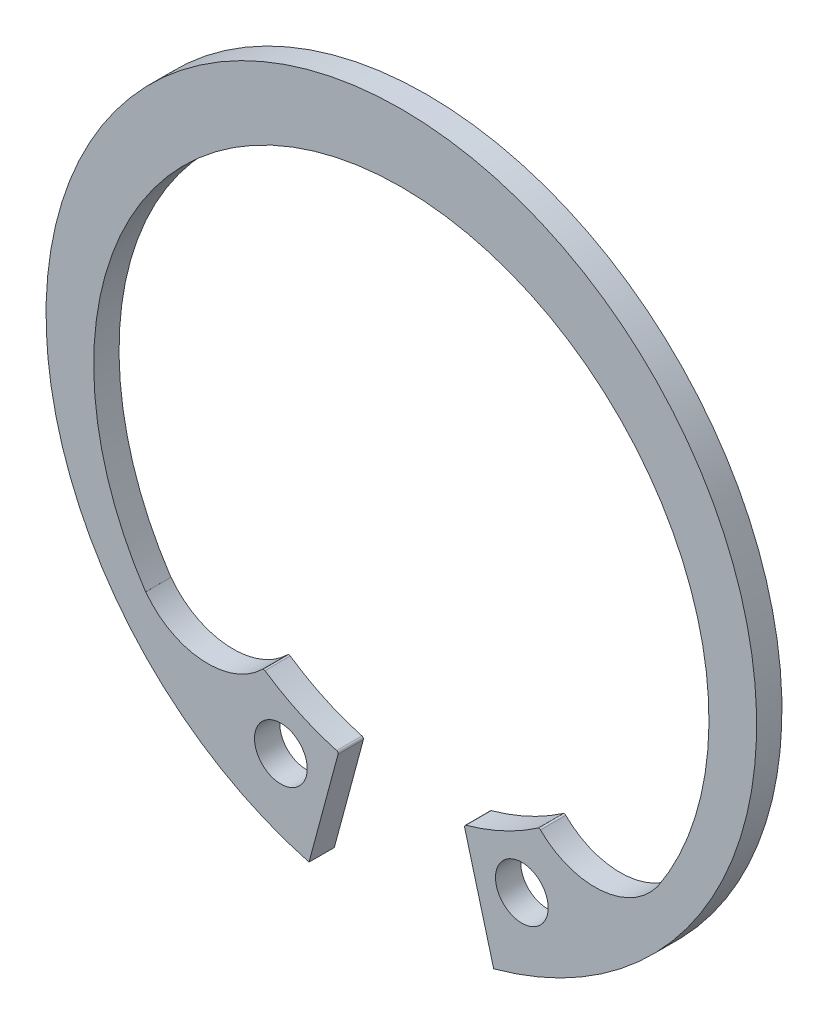
ISO-10303-21;
HEADER;
FILE_DESCRIPTION(('STEP AP214'),'2;1');
FILE_NAME('part.step','',(''),(''),'','','');
FILE_SCHEMA(('AUTOMOTIVE_DESIGN { 1 0 10303 214 1 1 1 1 }'));
ENDSEC;
DATA;
#1=APPLICATION_CONTEXT('core data for automotive mechanical design processes');
#2=APPLICATION_PROTOCOL_DEFINITION('international standard','automotive_design',2000,#1);
#3=PRODUCT_CONTEXT('',#1,'mechanical');
#4=PRODUCT('Part','Part','',(#3));
#5=PRODUCT_RELATED_PRODUCT_CATEGORY('part','',(#4));
#6=PRODUCT_DEFINITION_FORMATION('','',#4);
#7=PRODUCT_DEFINITION_CONTEXT('part definition',#1,'design');
#8=PRODUCT_DEFINITION('design','',#6,#7);
#9=PRODUCT_DEFINITION_SHAPE('','',#8);
#10=(LENGTH_UNIT() NAMED_UNIT(*) SI_UNIT(.MILLI.,.METRE.));
#11=(NAMED_UNIT(*) PLANE_ANGLE_UNIT() SI_UNIT($,.RADIAN.));
#12=(NAMED_UNIT(*) SI_UNIT($,.STERADIAN.) SOLID_ANGLE_UNIT());
#13=UNCERTAINTY_MEASURE_WITH_UNIT(LENGTH_MEASURE(1.E-05),#10,'distance_accuracy_value','');
#14=(GEOMETRIC_REPRESENTATION_CONTEXT(3) GLOBAL_UNCERTAINTY_ASSIGNED_CONTEXT((#13)) GLOBAL_UNIT_ASSIGNED_CONTEXT((#10,
#11,#12)) REPRESENTATION_CONTEXT('',''));
#15=CARTESIAN_POINT('',(0.,0.,0.));
#16=DIRECTION('',(0.,0.,1.));
#17=DIRECTION('',(1.,0.,0.));
#18=AXIS2_PLACEMENT_3D('',#15,#16,#17);
#19=CARTESIAN_POINT('',(0.,0.,-1.2));
#20=DIRECTION('',(0.,0.,1.));
#21=DIRECTION('',(1.,0.,0.));
#22=AXIS2_PLACEMENT_3D('',#19,#20,#21);
#23=CYLINDRICAL_SURFACE('',#22,16.85);
#24=CARTESIAN_POINT('',(0.,0.,-1.2));
#25=DIRECTION('',(0.,0.,1.));
#26=DIRECTION('',(1.,0.,0.));
#27=AXIS2_PLACEMENT_3D('',#24,#25,#26);
#28=CIRCLE('',#27,16.85);
#29=CARTESIAN_POINT('',(4.37879984249977,-16.2710974411477,-1.2));
#30=VERTEX_POINT('',#29);
#31=CARTESIAN_POINT('',(-4.37879984249977,-16.2710974411477,-1.2));
#32=VERTEX_POINT('',#31);
#33=EDGE_CURVE('E48',#30,#32,#28,.T.);
#34=ORIENTED_EDGE('',*,*,#33,.T.);
#35=DIRECTION('',(0.,0.,1.));
#36=VECTOR('',#35,1.);
#37=CARTESIAN_POINT('',(-4.37879984249977,-16.2710974411477,-1.2));
#38=LINE('',#37,#36);
#39=CARTESIAN_POINT('',(-4.37879984249977,-16.2710974411477,0.));
#40=VERTEX_POINT('',#39);
#41=EDGE_CURVE('E35',#32,#40,#38,.T.);
#42=ORIENTED_EDGE('',*,*,#41,.T.);
#43=CARTESIAN_POINT('',(0.,0.,0.));
#44=DIRECTION('',(0.,0.,1.));
#45=DIRECTION('',(1.,0.,0.));
#46=AXIS2_PLACEMENT_3D('',#43,#44,#45);
#47=CIRCLE('',#46,16.85);
#48=CARTESIAN_POINT('',(4.37879984249977,-16.2710974411477,0.));
#49=VERTEX_POINT('',#48);
#50=EDGE_CURVE('E137',#49,#40,#47,.T.);
#51=ORIENTED_EDGE('',*,*,#50,.F.);
#52=DIRECTION('',(0.,0.,1.));
#53=VECTOR('',#52,1.);
#54=CARTESIAN_POINT('',(4.37879984249977,-16.2710974411477,-1.2));
#55=LINE('',#54,#53);
#56=EDGE_CURVE('E11',#30,#49,#55,.T.);
#57=ORIENTED_EDGE('',*,*,#56,.F.);
#58=EDGE_LOOP('',(#34,#42,#51,#57));
#59=FACE_BOUND('',#58,.T.);
#60=ADVANCED_FACE('F32',(#59),#23,.T.);
#61=CARTESIAN_POINT('',(4.37879984249977,-16.2710974411477,-1.2));
#62=DIRECTION('',(-0.965643765053277,-0.259869426854586,0.));
#63=DIRECTION('',(0.259869426854586,-0.965643765053277,0.));
#64=AXIS2_PLACEMENT_3D('',#61,#62,#63);
#65=PLANE('',#64);
#66=DIRECTION('',(0.259869426854586,-0.965643765053277,0.));
#67=VECTOR('',#66,1.);
#68=CARTESIAN_POINT('',(4.37879984249977,-16.2710974411477,0.));
#69=LINE('',#68,#67);
#70=CARTESIAN_POINT('',(3.00137938047477,-11.1527674509272,0.));
#71=VERTEX_POINT('',#70);
#72=EDGE_CURVE('E245',#71,#49,#69,.T.);
#73=ORIENTED_EDGE('',*,*,#72,.F.);
#74=DIRECTION('',(0.,0.,1.));
#75=VECTOR('',#74,1.);
#76=CARTESIAN_POINT('',(3.00137938047477,-11.1527674509272,-1.2));
#77=LINE('',#76,#75);
#78=CARTESIAN_POINT('',(3.00137938047477,-11.1527674509272,-1.2));
#79=VERTEX_POINT('',#78);
#80=EDGE_CURVE('E215',#79,#71,#77,.T.);
#81=ORIENTED_EDGE('',*,*,#80,.F.);
#82=DIRECTION('',(0.259869426854586,-0.965643765053277,0.));
#83=VECTOR('',#82,1.);
#84=CARTESIAN_POINT('',(4.37879984249977,-16.2710974411477,-1.2));
#85=LINE('',#84,#83);
#86=EDGE_CURVE('E251',#79,#30,#85,.T.);
#87=ORIENTED_EDGE('',*,*,#86,.T.);
#88=ORIENTED_EDGE('',*,*,#56,.T.);
#89=EDGE_LOOP('',(#73,#81,#87,#88));
#90=FACE_BOUND('',#89,.T.);
#91=ADVANCED_FACE('F300',(#90),#65,.T.);
#92=CARTESIAN_POINT('',(0.,-0.938821108372822,-1.2));
#93=DIRECTION('',(0.,0.,1.));
#94=DIRECTION('',(1.,0.,0.));
#95=AXIS2_PLACEMENT_3D('',#92,#93,#94);
#96=CYLINDRICAL_SURFACE('',#95,14.5888211083728);
#97=DIRECTION('',(0.,0.,1.));
#98=VECTOR('',#97,1.);
#99=CARTESIAN_POINT('',(-12.1286137504347,-9.04625163998214,-1.2));
#100=LINE('',#99,#98);
#101=CARTESIAN_POINT('',(-12.1286137504347,-9.04625163998214,-1.2));
#102=VERTEX_POINT('',#101);
#103=CARTESIAN_POINT('',(-12.1286137504347,-9.04625163998214,0.));
#104=VERTEX_POINT('',#103);
#105=EDGE_CURVE('E180',#102,#104,#100,.T.);
#106=ORIENTED_EDGE('',*,*,#105,.F.);
#107=CARTESIAN_POINT('',(0.,-0.938821108372822,-1.2));
#108=DIRECTION('',(0.,0.,-1.));
#109=DIRECTION('',(1.,0.,0.));
#110=AXIS2_PLACEMENT_3D('',#107,#108,#109);
#111=CIRCLE('',#110,14.5888211083728);
#112=CARTESIAN_POINT('',(12.1286137504347,-9.04625163998214,-1.2));
#113=VERTEX_POINT('',#112);
#114=EDGE_CURVE('E249',#102,#113,#111,.T.);
#115=ORIENTED_EDGE('',*,*,#114,.T.);
#116=DIRECTION('',(0.,0.,1.));
#117=VECTOR('',#116,1.);
#118=CARTESIAN_POINT('',(12.1286137504347,-9.04625163998214,-1.2));
#119=LINE('',#118,#117);
#120=CARTESIAN_POINT('',(12.1286137504347,-9.04625163998214,0.));
#121=VERTEX_POINT('',#120);
#122=EDGE_CURVE('E218',#121,#113,#119,.F.);
#123=ORIENTED_EDGE('',*,*,#122,.F.);
#124=CARTESIAN_POINT('',(0.,-0.938821108372822,0.));
#125=DIRECTION('',(0.,0.,-1.));
#126=DIRECTION('',(1.,0.,0.));
#127=AXIS2_PLACEMENT_3D('',#124,#125,#126);
#128=CIRCLE('',#127,14.5888211083728);
#129=EDGE_CURVE('E139',#104,#121,#128,.T.);
#130=ORIENTED_EDGE('',*,*,#129,.F.);
#131=EDGE_LOOP('',(#106,#115,#123,#130));
#132=FACE_BOUND('',#131,.T.);
#133=ADVANCED_FACE('F279',(#132),#96,.F.);
#134=CARTESIAN_POINT('',(-4.37879984249977,-16.2710974411477,-1.2));
#135=DIRECTION('',(0.965643765053277,-0.259869426854586,0.));
#136=DIRECTION('',(0.259869426854586,0.965643765053277,0.));
#137=AXIS2_PLACEMENT_3D('',#134,#135,#136);
#138=PLANE('',#137);
#139=DIRECTION('',(0.259869426854586,0.965643765053277,0.));
#140=VECTOR('',#139,1.);
#141=CARTESIAN_POINT('',(-4.37879984249977,-16.2710974411477,0.));
#142=LINE('',#141,#140);
#143=CARTESIAN_POINT('',(-3.00137938047477,-11.1527674509272,0.));
#144=VERTEX_POINT('',#143);
#145=EDGE_CURVE('E129',#40,#144,#142,.T.);
#146=ORIENTED_EDGE('',*,*,#145,.F.);
#147=ORIENTED_EDGE('',*,*,#41,.F.);
#148=DIRECTION('',(0.259869426854586,0.965643765053277,0.));
#149=VECTOR('',#148,1.);
#150=CARTESIAN_POINT('',(-4.37879984249977,-16.2710974411477,-1.2));
#151=LINE('',#150,#149);
#152=CARTESIAN_POINT('',(-3.00137938047477,-11.1527674509272,-1.2));
#153=VERTEX_POINT('',#152);
#154=EDGE_CURVE('E145',#32,#153,#151,.T.);
#155=ORIENTED_EDGE('',*,*,#154,.T.);
#156=DIRECTION('',(0.,0.,1.));
#157=VECTOR('',#156,1.);
#158=CARTESIAN_POINT('',(-3.00137938047477,-11.1527674509272,-1.2));
#159=LINE('',#158,#157);
#160=EDGE_CURVE('E142',#153,#144,#159,.T.);
#161=ORIENTED_EDGE('',*,*,#160,.T.);
#162=EDGE_LOOP('',(#146,#147,#155,#161));
#163=FACE_BOUND('',#162,.T.);
#164=ADVANCED_FACE('F143',(#163),#138,.T.);
#165=CARTESIAN_POINT('',(0.,0.,-1.2));
#166=DIRECTION('',(0.,0.,1.));
#167=DIRECTION('',(1.,0.,0.));
#168=AXIS2_PLACEMENT_3D('',#165,#166,#167);
#169=PLANE('',#168);
#170=ORIENTED_EDGE('',*,*,#114,.F.);
#171=DIRECTION('',(-0.801589980532697,-0.597874153237611,0.));
#172=VECTOR('',#171,1.);
#173=CARTESIAN_POINT('',(-13.506791171976,-10.0741794820537,-1.2));
#174=LINE('',#173,#172);
#175=CARTESIAN_POINT('',(-12.1233619181028,-9.04233450667883,-1.2));
#176=VERTEX_POINT('',#175);
#177=EDGE_CURVE('E150',#176,#102,#174,.T.);
#178=ORIENTED_EDGE('',*,*,#177,.F.);
#179=CARTESIAN_POINT('',(-9.17820527709939,-6.84565905457063,-1.2));
#180=DIRECTION('',(0.,0.,-1.));
#181=DIRECTION('',(1.,0.,0.));
#182=AXIS2_PLACEMENT_3D('',#179,#180,#181);
#183=CIRCLE('',#182,3.67414353039474);
#184=CARTESIAN_POINT('',(-6.59559305403814,-9.45897969835626,-1.2));
#185=VERTEX_POINT('',#184);
#186=EDGE_CURVE('E174',#185,#176,#183,.T.);
#187=ORIENTED_EDGE('',*,*,#186,.F.);
#188=CARTESIAN_POINT('',(-6.52530150985386,-9.53010704061077,-1.2));
#189=DIRECTION('',(0.,0.,1.));
#190=DIRECTION('',(1.,0.,0.));
#191=AXIS2_PLACEMENT_3D('',#188,#189,#190);
#192=CIRCLE('',#191,0.1);
#193=CARTESIAN_POINT('',(-6.46880539288543,-9.44759529134141,-1.2));
#194=VERTEX_POINT('',#193);
#195=EDGE_CURVE('E171',#194,#185,#192,.T.);
#196=ORIENTED_EDGE('',*,*,#195,.F.);
#197=CARTESIAN_POINT('',(0.,0.,-1.2));
#198=DIRECTION('',(0.,0.,-1.));
#199=DIRECTION('',(1.,0.,0.));
#200=AXIS2_PLACEMENT_3D('',#197,#198,#199);
#201=CIRCLE('',#200,11.45);
#202=CARTESIAN_POINT('',(-3.07112173311014,-11.0304447462656,-1.2));
#203=VERTEX_POINT('',#202);
#204=EDGE_CURVE('E169',#203,#194,#201,.T.);
#205=ORIENTED_EDGE('',*,*,#204,.F.);
#206=CARTESIAN_POINT('',(-3.0979437569801,-11.1267805082417,-1.2));
#207=DIRECTION('',(0.,0.,1.));
#208=DIRECTION('',(-1.,0.,0.));
#209=AXIS2_PLACEMENT_3D('',#206,#207,#208);
#210=CIRCLE('',#209,0.0999999999999999);
#211=EDGE_CURVE('E167',#153,#203,#210,.T.);
#212=ORIENTED_EDGE('',*,*,#211,.F.);
#213=ORIENTED_EDGE('',*,*,#154,.F.);
#214=ORIENTED_EDGE('',*,*,#33,.F.);
#215=ORIENTED_EDGE('',*,*,#86,.F.);
#216=CARTESIAN_POINT('',(3.0979437569801,-11.1267805082417,-1.2));
#217=DIRECTION('',(0.,0.,1.));
#218=DIRECTION('',(1.,0.,0.));
#219=AXIS2_PLACEMENT_3D('',#216,#217,#218);
#220=CIRCLE('',#219,0.100000000000001);
#221=CARTESIAN_POINT('',(3.07112173311014,-11.0304447462656,-1.2));
#222=VERTEX_POINT('',#221);
#223=EDGE_CURVE('E211',#222,#79,#220,.T.);
#224=ORIENTED_EDGE('',*,*,#223,.F.);
#225=CARTESIAN_POINT('',(0.,0.,-1.2));
#226=DIRECTION('',(0.,0.,-1.));
#227=DIRECTION('',(1.,0.,0.));
#228=AXIS2_PLACEMENT_3D('',#225,#226,#227);
#229=CIRCLE('',#228,11.45);
#230=CARTESIAN_POINT('',(6.46880539288542,-9.44759529134142,-1.2));
#231=VERTEX_POINT('',#230);
#232=EDGE_CURVE('E209',#231,#222,#229,.T.);
#233=ORIENTED_EDGE('',*,*,#232,.F.);
#234=CARTESIAN_POINT('',(6.52530150985386,-9.53010704061077,-1.2));
#235=DIRECTION('',(0.,0.,1.));
#236=DIRECTION('',(-1.,0.,0.));
#237=AXIS2_PLACEMENT_3D('',#234,#235,#236);
#238=CIRCLE('',#237,0.1);
#239=CARTESIAN_POINT('',(6.59559305403814,-9.45897969835626,-1.2));
#240=VERTEX_POINT('',#239);
#241=EDGE_CURVE('E206',#240,#231,#238,.T.);
#242=ORIENTED_EDGE('',*,*,#241,.F.);
#243=CARTESIAN_POINT('',(9.17820527709939,-6.84565905457063,-1.2));
#244=DIRECTION('',(0.,0.,-1.));
#245=DIRECTION('',(1.,0.,0.));
#246=AXIS2_PLACEMENT_3D('',#243,#244,#245);
#247=CIRCLE('',#246,3.67414353039474);
#248=CARTESIAN_POINT('',(12.1233619181028,-9.04233450667883,-1.2));
#249=VERTEX_POINT('',#248);
#250=EDGE_CURVE('E203',#249,#240,#247,.T.);
#251=ORIENTED_EDGE('',*,*,#250,.F.);
#252=DIRECTION('',(-0.801589980532697,0.597874153237611,0.));
#253=VECTOR('',#252,1.);
#254=CARTESIAN_POINT('',(12.1233619181028,-9.04233450667883,-1.2));
#255=LINE('',#254,#253);
#256=EDGE_CURVE('E201',#113,#249,#255,.T.);
#257=ORIENTED_EDGE('',*,*,#256,.F.);
#258=EDGE_LOOP('',(#170,#178,#187,#196,#205,#212,#213,#214,#215,#224,#233,#242,#251,#257));
#259=FACE_BOUND('',#258,.T.);
#260=CARTESIAN_POINT('',(5.7142084974275,-12.4789200753882,-1.2));
#261=DIRECTION('',(0.,0.,1.));
#262=DIRECTION('',(1.,0.,0.));
#263=AXIS2_PLACEMENT_3D('',#260,#261,#262);
#264=CIRCLE('',#263,1.25);
#265=CARTESIAN_POINT('',(6.9642084974275,-12.4789200753882,-1.2));
#266=VERTEX_POINT('',#265);
#267=EDGE_CURVE('E240',#266,#266,#264,.T.);
#268=ORIENTED_EDGE('',*,*,#267,.T.);
#269=EDGE_LOOP('',(#268));
#270=FACE_BOUND('',#269,.T.);
#271=CARTESIAN_POINT('',(-5.7142084974275,-12.4789200753882,-1.2));
#272=DIRECTION('',(0.,0.,1.));
#273=DIRECTION('',(1.,0.,0.));
#274=AXIS2_PLACEMENT_3D('',#271,#272,#273);
#275=CIRCLE('',#274,1.25);
#276=CARTESIAN_POINT('',(-4.4642084974275,-12.4789200753882,-1.2));
#277=VERTEX_POINT('',#276);
#278=EDGE_CURVE('E234',#277,#277,#275,.T.);
#279=ORIENTED_EDGE('',*,*,#278,.T.);
#280=EDGE_LOOP('',(#279));
#281=FACE_BOUND('',#280,.T.);
#282=ADVANCED_FACE('F257',(#259,#270,#281),#169,.F.);
#283=CARTESIAN_POINT('',(0.,0.,0.));
#284=DIRECTION('',(0.,0.,1.));
#285=DIRECTION('',(1.,0.,0.));
#286=AXIS2_PLACEMENT_3D('',#283,#284,#285);
#287=PLANE('',#286);
#288=DIRECTION('',(-0.801589980532697,-0.597874153237611,0.));
#289=VECTOR('',#288,1.);
#290=CARTESIAN_POINT('',(-13.506791171976,-10.0741794820537,0.));
#291=LINE('',#290,#289);
#292=CARTESIAN_POINT('',(-12.1233619181028,-9.04233450667883,0.));
#293=VERTEX_POINT('',#292);
#294=EDGE_CURVE('E165',#293,#104,#291,.T.);
#295=ORIENTED_EDGE('',*,*,#294,.T.);
#296=ORIENTED_EDGE('',*,*,#129,.T.);
#297=DIRECTION('',(-0.801589980532697,0.597874153237611,0.));
#298=VECTOR('',#297,1.);
#299=CARTESIAN_POINT('',(12.1233619181028,-9.04233450667883,0.));
#300=LINE('',#299,#298);
#301=CARTESIAN_POINT('',(12.1233619181028,-9.04233450667883,0.));
#302=VERTEX_POINT('',#301);
#303=EDGE_CURVE('E188',#121,#302,#300,.T.);
#304=ORIENTED_EDGE('',*,*,#303,.T.);
#305=CARTESIAN_POINT('',(9.17820527709939,-6.84565905457063,0.));
#306=DIRECTION('',(0.,0.,-1.));
#307=DIRECTION('',(1.,0.,0.));
#308=AXIS2_PLACEMENT_3D('',#305,#306,#307);
#309=CIRCLE('',#308,3.67414353039474);
#310=CARTESIAN_POINT('',(6.59559305403814,-9.45897969835626,0.));
#311=VERTEX_POINT('',#310);
#312=EDGE_CURVE('E190',#302,#311,#309,.T.);
#313=ORIENTED_EDGE('',*,*,#312,.T.);
#314=CARTESIAN_POINT('',(6.52530150985386,-9.53010704061077,0.));
#315=DIRECTION('',(0.,0.,1.));
#316=DIRECTION('',(-1.,0.,0.));
#317=AXIS2_PLACEMENT_3D('',#314,#315,#316);
#318=CIRCLE('',#317,0.1);
#319=CARTESIAN_POINT('',(6.46880539288542,-9.44759529134142,0.));
#320=VERTEX_POINT('',#319);
#321=EDGE_CURVE('E193',#311,#320,#318,.T.);
#322=ORIENTED_EDGE('',*,*,#321,.T.);
#323=CARTESIAN_POINT('',(0.,0.,0.));
#324=DIRECTION('',(0.,0.,-1.));
#325=DIRECTION('',(1.,0.,0.));
#326=AXIS2_PLACEMENT_3D('',#323,#324,#325);
#327=CIRCLE('',#326,11.45);
#328=CARTESIAN_POINT('',(3.07112173311014,-11.0304447462656,0.));
#329=VERTEX_POINT('',#328);
#330=EDGE_CURVE('E196',#320,#329,#327,.T.);
#331=ORIENTED_EDGE('',*,*,#330,.T.);
#332=CARTESIAN_POINT('',(3.0979437569801,-11.1267805082417,0.));
#333=DIRECTION('',(0.,0.,1.));
#334=DIRECTION('',(1.,0.,0.));
#335=AXIS2_PLACEMENT_3D('',#332,#333,#334);
#336=CIRCLE('',#335,0.100000000000001);
#337=EDGE_CURVE('E198',#329,#71,#336,.T.);
#338=ORIENTED_EDGE('',*,*,#337,.T.);
#339=ORIENTED_EDGE('',*,*,#72,.T.);
#340=ORIENTED_EDGE('',*,*,#50,.T.);
#341=ORIENTED_EDGE('',*,*,#145,.T.);
#342=CARTESIAN_POINT('',(-3.0979437569801,-11.1267805082417,0.));
#343=DIRECTION('',(0.,0.,1.));
#344=DIRECTION('',(-1.,0.,0.));
#345=AXIS2_PLACEMENT_3D('',#342,#343,#344);
#346=CIRCLE('',#345,0.0999999999999999);
#347=CARTESIAN_POINT('',(-3.07112173311014,-11.0304447462656,0.));
#348=VERTEX_POINT('',#347);
#349=EDGE_CURVE('E135',#144,#348,#346,.T.);
#350=ORIENTED_EDGE('',*,*,#349,.T.);
#351=CARTESIAN_POINT('',(0.,0.,0.));
#352=DIRECTION('',(0.,0.,-1.));
#353=DIRECTION('',(1.,0.,0.));
#354=AXIS2_PLACEMENT_3D('',#351,#352,#353);
#355=CIRCLE('',#354,11.45);
#356=CARTESIAN_POINT('',(-6.46880539288543,-9.44759529134141,0.));
#357=VERTEX_POINT('',#356);
#358=EDGE_CURVE('E155',#348,#357,#355,.T.);
#359=ORIENTED_EDGE('',*,*,#358,.T.);
#360=CARTESIAN_POINT('',(-6.52530150985386,-9.53010704061077,0.));
#361=DIRECTION('',(0.,0.,1.));
#362=DIRECTION('',(1.,0.,0.));
#363=AXIS2_PLACEMENT_3D('',#360,#361,#362);
#364=CIRCLE('',#363,0.1);
#365=CARTESIAN_POINT('',(-6.59559305403814,-9.45897969835626,0.));
#366=VERTEX_POINT('',#365);
#367=EDGE_CURVE('E157',#357,#366,#364,.T.);
#368=ORIENTED_EDGE('',*,*,#367,.T.);
#369=CARTESIAN_POINT('',(-9.17820527709939,-6.84565905457063,0.));
#370=DIRECTION('',(0.,0.,-1.));
#371=DIRECTION('',(1.,0.,0.));
#372=AXIS2_PLACEMENT_3D('',#369,#370,#371);
#373=CIRCLE('',#372,3.67414353039474);
#374=EDGE_CURVE('E162',#366,#293,#373,.T.);
#375=ORIENTED_EDGE('',*,*,#374,.T.);
#376=EDGE_LOOP('',(#295,#296,#304,#313,#322,#331,#338,#339,#340,#341,#350,#359,#368,#375));
#377=FACE_BOUND('',#376,.T.);
#378=CARTESIAN_POINT('',(5.7142084974275,-12.4789200753882,0.));
#379=DIRECTION('',(0.,0.,1.));
#380=DIRECTION('',(1.,0.,0.));
#381=AXIS2_PLACEMENT_3D('',#378,#379,#380);
#382=CIRCLE('',#381,1.25);
#383=CARTESIAN_POINT('',(6.9642084974275,-12.4789200753882,0.));
#384=VERTEX_POINT('',#383);
#385=EDGE_CURVE('E237',#384,#384,#382,.T.);
#386=ORIENTED_EDGE('',*,*,#385,.F.);
#387=EDGE_LOOP('',(#386));
#388=FACE_BOUND('',#387,.T.);
#389=CARTESIAN_POINT('',(-5.7142084974275,-12.4789200753882,0.));
#390=DIRECTION('',(0.,0.,1.));
#391=DIRECTION('',(1.,0.,0.));
#392=AXIS2_PLACEMENT_3D('',#389,#390,#391);
#393=CIRCLE('',#392,1.25);
#394=CARTESIAN_POINT('',(-4.4642084974275,-12.4789200753882,0.));
#395=VERTEX_POINT('',#394);
#396=EDGE_CURVE('E231',#395,#395,#393,.T.);
#397=ORIENTED_EDGE('',*,*,#396,.F.);
#398=EDGE_LOOP('',(#397));
#399=FACE_BOUND('',#398,.T.);
#400=ADVANCED_FACE('F132',(#377,#388,#399),#287,.T.);
#401=CARTESIAN_POINT('',(5.7142084974275,-12.4789200753882,-1.2));
#402=DIRECTION('',(0.,0.,1.));
#403=DIRECTION('',(1.,0.,0.));
#404=AXIS2_PLACEMENT_3D('',#401,#402,#403);
#405=CYLINDRICAL_SURFACE('',#404,1.25);
#406=ORIENTED_EDGE('',*,*,#267,.F.);
#407=EDGE_LOOP('',(#406));
#408=FACE_BOUND('',#407,.T.);
#409=ORIENTED_EDGE('',*,*,#385,.T.);
#410=EDGE_LOOP('',(#409));
#411=FACE_BOUND('',#410,.T.);
#412=ADVANCED_FACE('F317',(#408,#411),#405,.F.);
#413=CARTESIAN_POINT('',(-5.7142084974275,-12.4789200753882,-1.2));
#414=DIRECTION('',(0.,0.,1.));
#415=DIRECTION('',(1.,0.,0.));
#416=AXIS2_PLACEMENT_3D('',#413,#414,#415);
#417=CYLINDRICAL_SURFACE('',#416,1.25);
#418=ORIENTED_EDGE('',*,*,#278,.F.);
#419=EDGE_LOOP('',(#418));
#420=FACE_BOUND('',#419,.T.);
#421=ORIENTED_EDGE('',*,*,#396,.T.);
#422=EDGE_LOOP('',(#421));
#423=FACE_BOUND('',#422,.T.);
#424=ADVANCED_FACE('F321',(#420,#423),#417,.F.);
#425=CARTESIAN_POINT('',(0.,0.,-1.2));
#426=DIRECTION('',(0.,0.,1.));
#427=DIRECTION('',(1.,0.,0.));
#428=AXIS2_PLACEMENT_3D('',#425,#426,#427);
#429=CYLINDRICAL_SURFACE('',#428,11.45);
#430=ORIENTED_EDGE('',*,*,#330,.F.);
#431=DIRECTION('',(0.,0.,1.));
#432=VECTOR('',#431,1.);
#433=CARTESIAN_POINT('',(6.46880539288542,-9.44759529134142,-1.2));
#434=LINE('',#433,#432);
#435=EDGE_CURVE('E222',#231,#320,#434,.T.);
#436=ORIENTED_EDGE('',*,*,#435,.F.);
#437=ORIENTED_EDGE('',*,*,#232,.T.);
#438=DIRECTION('',(0.,0.,1.));
#439=VECTOR('',#438,1.);
#440=CARTESIAN_POINT('',(3.07112173311014,-11.0304447462656,-1.2));
#441=LINE('',#440,#439);
#442=EDGE_CURVE('E219',#222,#329,#441,.T.);
#443=ORIENTED_EDGE('',*,*,#442,.T.);
#444=EDGE_LOOP('',(#430,#436,#437,#443));
#445=FACE_BOUND('',#444,.T.);
#446=ADVANCED_FACE('F294',(#445),#429,.F.);
#447=CARTESIAN_POINT('',(3.0979437569801,-11.1267805082417,-1.2));
#448=DIRECTION('',(0.,0.,1.));
#449=DIRECTION('',(1.,0.,0.));
#450=AXIS2_PLACEMENT_3D('',#447,#448,#449);
#451=CYLINDRICAL_SURFACE('',#450,0.100000000000001);
#452=ORIENTED_EDGE('',*,*,#337,.F.);
#453=ORIENTED_EDGE('',*,*,#442,.F.);
#454=ORIENTED_EDGE('',*,*,#223,.T.);
#455=ORIENTED_EDGE('',*,*,#80,.T.);
#456=EDGE_LOOP('',(#452,#453,#454,#455));
#457=FACE_BOUND('',#456,.T.);
#458=ADVANCED_FACE('F299',(#457),#451,.T.);
#459=CARTESIAN_POINT('',(6.52530150985386,-9.53010704061077,-1.2));
#460=DIRECTION('',(0.,0.,1.));
#461=DIRECTION('',(1.,0.,0.));
#462=AXIS2_PLACEMENT_3D('',#459,#460,#461);
#463=CYLINDRICAL_SURFACE('',#462,0.1);
#464=ORIENTED_EDGE('',*,*,#321,.F.);
#465=DIRECTION('',(0.,0.,1.));
#466=VECTOR('',#465,1.);
#467=CARTESIAN_POINT('',(6.59559305403814,-9.45897969835626,-1.2));
#468=LINE('',#467,#466);
#469=EDGE_CURVE('E225',#240,#311,#468,.T.);
#470=ORIENTED_EDGE('',*,*,#469,.F.);
#471=ORIENTED_EDGE('',*,*,#241,.T.);
#472=ORIENTED_EDGE('',*,*,#435,.T.);
#473=EDGE_LOOP('',(#464,#470,#471,#472));
#474=FACE_BOUND('',#473,.T.);
#475=ADVANCED_FACE('F291',(#474),#463,.T.);
#476=CARTESIAN_POINT('',(9.17820527709939,-6.84565905457063,-1.2));
#477=DIRECTION('',(0.,0.,1.));
#478=DIRECTION('',(1.,0.,0.));
#479=AXIS2_PLACEMENT_3D('',#476,#477,#478);
#480=CYLINDRICAL_SURFACE('',#479,3.67414353039474);
#481=ORIENTED_EDGE('',*,*,#312,.F.);
#482=DIRECTION('',(0.,0.,1.));
#483=VECTOR('',#482,1.);
#484=CARTESIAN_POINT('',(12.1233619181028,-9.04233450667883,-1.2));
#485=LINE('',#484,#483);
#486=EDGE_CURVE('E214',#249,#302,#485,.T.);
#487=ORIENTED_EDGE('',*,*,#486,.F.);
#488=ORIENTED_EDGE('',*,*,#250,.T.);
#489=ORIENTED_EDGE('',*,*,#469,.T.);
#490=EDGE_LOOP('',(#481,#487,#488,#489));
#491=FACE_BOUND('',#490,.T.);
#492=ADVANCED_FACE('F288',(#491),#480,.F.);
#493=CARTESIAN_POINT('',(12.1233619181028,-9.04233450667883,-1.2));
#494=DIRECTION('',(0.597874153237611,0.801589980532697,0.));
#495=DIRECTION('',(-0.801589980532697,0.597874153237611,0.));
#496=AXIS2_PLACEMENT_3D('',#493,#494,#495);
#497=PLANE('',#496);
#498=ORIENTED_EDGE('',*,*,#303,.F.);
#499=ORIENTED_EDGE('',*,*,#122,.T.);
#500=ORIENTED_EDGE('',*,*,#256,.T.);
#501=ORIENTED_EDGE('',*,*,#486,.T.);
#502=EDGE_LOOP('',(#498,#499,#500,#501));
#503=FACE_BOUND('',#502,.T.);
#504=ADVANCED_FACE('F282',(#503),#497,.T.);
#505=CARTESIAN_POINT('',(0.,0.,-1.2));
#506=DIRECTION('',(0.,0.,1.));
#507=DIRECTION('',(1.,0.,0.));
#508=AXIS2_PLACEMENT_3D('',#505,#506,#507);
#509=CYLINDRICAL_SURFACE('',#508,11.45);
#510=ORIENTED_EDGE('',*,*,#358,.F.);
#511=DIRECTION('',(0.,0.,1.));
#512=VECTOR('',#511,1.);
#513=CARTESIAN_POINT('',(-3.07112173311014,-11.0304447462656,-1.2));
#514=LINE('',#513,#512);
#515=EDGE_CURVE('E149',#203,#348,#514,.T.);
#516=ORIENTED_EDGE('',*,*,#515,.F.);
#517=ORIENTED_EDGE('',*,*,#204,.T.);
#518=DIRECTION('',(0.,0.,1.));
#519=VECTOR('',#518,1.);
#520=CARTESIAN_POINT('',(-6.46880539288543,-9.44759529134141,-1.2));
#521=LINE('',#520,#519);
#522=EDGE_CURVE('E183',#194,#357,#521,.T.);
#523=ORIENTED_EDGE('',*,*,#522,.T.);
#524=EDGE_LOOP('',(#510,#516,#517,#523));
#525=FACE_BOUND('',#524,.T.);
#526=ADVANCED_FACE('F263',(#525),#509,.F.);
#527=CARTESIAN_POINT('',(-13.506791171976,-10.0741794820537,-1.2));
#528=DIRECTION('',(-0.597874153237611,0.801589980532697,0.));
#529=DIRECTION('',(-0.801589980532697,-0.597874153237611,0.));
#530=AXIS2_PLACEMENT_3D('',#527,#528,#529);
#531=PLANE('',#530);
#532=ORIENTED_EDGE('',*,*,#177,.T.);
#533=ORIENTED_EDGE('',*,*,#105,.T.);
#534=ORIENTED_EDGE('',*,*,#294,.F.);
#535=DIRECTION('',(0.,0.,1.));
#536=VECTOR('',#535,1.);
#537=CARTESIAN_POINT('',(-12.1233619181028,-9.04233450667883,-1.2));
#538=LINE('',#537,#536);
#539=EDGE_CURVE('E178',#176,#293,#538,.T.);
#540=ORIENTED_EDGE('',*,*,#539,.F.);
#541=EDGE_LOOP('',(#532,#533,#534,#540));
#542=FACE_BOUND('',#541,.T.);
#543=ADVANCED_FACE('F273',(#542),#531,.T.);
#544=CARTESIAN_POINT('',(-9.17820527709939,-6.84565905457063,-1.2));
#545=DIRECTION('',(0.,0.,1.));
#546=DIRECTION('',(1.,0.,0.));
#547=AXIS2_PLACEMENT_3D('',#544,#545,#546);
#548=CYLINDRICAL_SURFACE('',#547,3.67414353039474);
#549=ORIENTED_EDGE('',*,*,#374,.F.);
#550=DIRECTION('',(0.,0.,1.));
#551=VECTOR('',#550,1.);
#552=CARTESIAN_POINT('',(-6.59559305403814,-9.45897969835626,-1.2));
#553=LINE('',#552,#551);
#554=EDGE_CURVE('E181',#185,#366,#553,.T.);
#555=ORIENTED_EDGE('',*,*,#554,.F.);
#556=ORIENTED_EDGE('',*,*,#186,.T.);
#557=ORIENTED_EDGE('',*,*,#539,.T.);
#558=EDGE_LOOP('',(#549,#555,#556,#557));
#559=FACE_BOUND('',#558,.T.);
#560=ADVANCED_FACE('F270',(#559),#548,.F.);
#561=CARTESIAN_POINT('',(-6.52530150985386,-9.53010704061077,-1.2));
#562=DIRECTION('',(0.,0.,1.));
#563=DIRECTION('',(1.,0.,0.));
#564=AXIS2_PLACEMENT_3D('',#561,#562,#563);
#565=CYLINDRICAL_SURFACE('',#564,0.1);
#566=ORIENTED_EDGE('',*,*,#367,.F.);
#567=ORIENTED_EDGE('',*,*,#522,.F.);
#568=ORIENTED_EDGE('',*,*,#195,.T.);
#569=ORIENTED_EDGE('',*,*,#554,.T.);
#570=EDGE_LOOP('',(#566,#567,#568,#569));
#571=FACE_BOUND('',#570,.T.);
#572=ADVANCED_FACE('F268',(#571),#565,.T.);
#573=CARTESIAN_POINT('',(-3.0979437569801,-11.1267805082417,-1.2));
#574=DIRECTION('',(0.,0.,1.));
#575=DIRECTION('',(1.,0.,0.));
#576=AXIS2_PLACEMENT_3D('',#573,#574,#575);
#577=CYLINDRICAL_SURFACE('',#576,0.0999999999999999);
#578=ORIENTED_EDGE('',*,*,#349,.F.);
#579=ORIENTED_EDGE('',*,*,#160,.F.);
#580=ORIENTED_EDGE('',*,*,#211,.T.);
#581=ORIENTED_EDGE('',*,*,#515,.T.);
#582=EDGE_LOOP('',(#578,#579,#580,#581));
#583=FACE_BOUND('',#582,.T.);
#584=ADVANCED_FACE('F153',(#583),#577,.T.);
#585=CLOSED_SHELL('',(#60,#91,#133,#164,#282,#400,#412,#424,#446,#458,#475,#492,#504,#526,#543,
#560,#572,#584));
#586=MANIFOLD_SOLID_BREP('B2',#585);
#587=ADVANCED_BREP_SHAPE_REPRESENTATION('',(#18,#586),#14);
#588=SHAPE_DEFINITION_REPRESENTATION(#9,#587);
ENDSEC;
END-ISO-10303-21;
